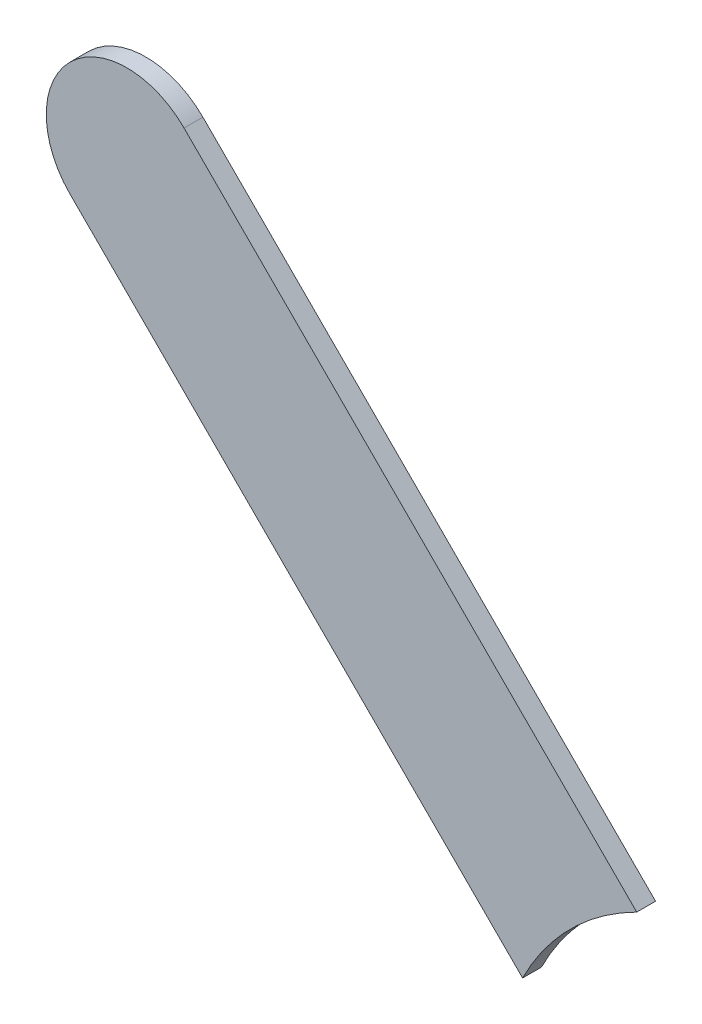
ISO-10303-21;
HEADER;
FILE_DESCRIPTION(('STEP AP214'),'2;1');
FILE_NAME('part.step','',(''),(''),'','','');
FILE_SCHEMA(('AUTOMOTIVE_DESIGN { 1 0 10303 214 1 1 1 1 }'));
ENDSEC;
DATA;
#1=APPLICATION_CONTEXT('core data for automotive mechanical design processes');
#2=APPLICATION_PROTOCOL_DEFINITION('international standard','automotive_design',2000,#1);
#3=PRODUCT_CONTEXT('',#1,'mechanical');
#4=PRODUCT('Part','Part','',(#3));
#5=PRODUCT_RELATED_PRODUCT_CATEGORY('part','',(#4));
#6=PRODUCT_DEFINITION_FORMATION('','',#4);
#7=PRODUCT_DEFINITION_CONTEXT('part definition',#1,'design');
#8=PRODUCT_DEFINITION('design','',#6,#7);
#9=PRODUCT_DEFINITION_SHAPE('','',#8);
#10=(LENGTH_UNIT() NAMED_UNIT(*) SI_UNIT(.MILLI.,.METRE.));
#11=(NAMED_UNIT(*) PLANE_ANGLE_UNIT() SI_UNIT($,.RADIAN.));
#12=(NAMED_UNIT(*) SI_UNIT($,.STERADIAN.) SOLID_ANGLE_UNIT());
#13=UNCERTAINTY_MEASURE_WITH_UNIT(LENGTH_MEASURE(1.E-05),#10,'distance_accuracy_value','');
#14=(GEOMETRIC_REPRESENTATION_CONTEXT(3) GLOBAL_UNCERTAINTY_ASSIGNED_CONTEXT((#13)) GLOBAL_UNIT_ASSIGNED_CONTEXT((#10,
#11,#12)) REPRESENTATION_CONTEXT('',''));
#15=CARTESIAN_POINT('',(0.,0.,0.));
#16=DIRECTION('',(0.,0.,1.));
#17=DIRECTION('',(1.,0.,0.));
#18=AXIS2_PLACEMENT_3D('',#15,#16,#17);
#19=CARTESIAN_POINT('',(165.346066,-68.303933,1.6));
#20=DIRECTION('',(-0.707106781186548,-0.707106781186548,0.));
#21=DIRECTION('',(-0.707106781186548,0.707106781186548,0.));
#22=AXIS2_PLACEMENT_3D('',#19,#20,#21);
#23=PLANE('',#22);
#24=DIRECTION('',(0.,0.,1.));
#25=VECTOR('',#24,1.);
#26=CARTESIAN_POINT('',(164.186066,-67.143933,1.6));
#27=LINE('',#26,#25);
#28=CARTESIAN_POINT('',(164.186066,-67.143933,1.6));
#29=VERTEX_POINT('',#28);
#30=CARTESIAN_POINT('',(164.186066,-67.143933,1.635));
#31=VERTEX_POINT('',#30);
#32=EDGE_CURVE('E11',#29,#31,#27,.T.);
#33=ORIENTED_EDGE('',*,*,#32,.T.);
#34=DIRECTION('',(-0.707106781186548,0.707106781186548,0.));
#35=VECTOR('',#34,1.);
#36=CARTESIAN_POINT('',(165.346066,-68.303933,1.635));
#37=LINE('',#36,#35);
#38=CARTESIAN_POINT('',(165.02737794109,-67.98524494109,1.635));
#39=VERTEX_POINT('',#38);
#40=EDGE_CURVE('E20',#39,#31,#37,.T.);
#41=ORIENTED_EDGE('',*,*,#40,.F.);
#42=DIRECTION('',(0.,0.,-1.));
#43=VECTOR('',#42,1.);
#44=CARTESIAN_POINT('',(165.02737794109,-67.98524494109,-0.045));
#45=LINE('',#44,#43);
#46=CARTESIAN_POINT('',(165.02737794109,-67.98524494109,1.6));
#47=VERTEX_POINT('',#46);
#48=EDGE_CURVE('E57',#39,#47,#45,.T.);
#49=ORIENTED_EDGE('',*,*,#48,.T.);
#50=DIRECTION('',(-0.707106781186548,0.707106781186548,0.));
#51=VECTOR('',#50,1.);
#52=CARTESIAN_POINT('',(165.346066,-68.303933,1.6));
#53=LINE('',#52,#51);
#54=EDGE_CURVE('E73',#47,#29,#53,.T.);
#55=ORIENTED_EDGE('',*,*,#54,.T.);
#56=EDGE_LOOP('',(#33,#41,#49,#55));
#57=FACE_BOUND('',#56,.T.);
#58=ADVANCED_FACE('F17',(#57),#23,.F.);
#59=CARTESIAN_POINT('',(164.0799995,-67.2499995,1.6));
#60=DIRECTION('',(0.,0.,-1.));
#61=DIRECTION('',(0.707106781187048,0.707106781186048,0.));
#62=AXIS2_PLACEMENT_3D('',#59,#60,#61);
#63=CYLINDRICAL_SURFACE('',#62,0.150000682813);
#64=CARTESIAN_POINT('',(164.0799995,-67.2499995,1.6));
#65=DIRECTION('',(0.,0.,1.));
#66=DIRECTION('',(0.707106781187048,0.707106781186048,0.));
#67=AXIS2_PLACEMENT_3D('',#64,#65,#66);
#68=CIRCLE('',#67,0.150000682813);
#69=CARTESIAN_POINT('',(163.973933,-67.356066,1.6));
#70=VERTEX_POINT('',#69);
#71=EDGE_CURVE('E66',#29,#70,#68,.T.);
#72=ORIENTED_EDGE('',*,*,#71,.T.);
#73=DIRECTION('',(0.,0.,1.));
#74=VECTOR('',#73,1.);
#75=CARTESIAN_POINT('',(163.973933,-67.356066,1.6));
#76=LINE('',#75,#74);
#77=CARTESIAN_POINT('',(163.973933,-67.356066,1.635));
#78=VERTEX_POINT('',#77);
#79=EDGE_CURVE('E89',#70,#78,#76,.T.);
#80=ORIENTED_EDGE('',*,*,#79,.T.);
#81=CARTESIAN_POINT('',(164.0799995,-67.2499995,1.635));
#82=DIRECTION('',(0.,0.,1.));
#83=DIRECTION('',(0.707106781187048,0.707106781186048,0.));
#84=AXIS2_PLACEMENT_3D('',#81,#82,#83);
#85=CIRCLE('',#84,0.150000682813);
#86=EDGE_CURVE('E68',#31,#78,#85,.T.);
#87=ORIENTED_EDGE('',*,*,#86,.F.);
#88=ORIENTED_EDGE('',*,*,#32,.F.);
#89=EDGE_LOOP('',(#72,#80,#87,#88));
#90=FACE_BOUND('',#89,.T.);
#91=ADVANCED_FACE('F64',(#90),#63,.T.);
#92=CARTESIAN_POINT('',(163.973933,-67.356066,1.635));
#93=DIRECTION('',(0.,0.,1.));
#94=DIRECTION('',(1.,0.,0.));
#95=AXIS2_PLACEMENT_3D('',#92,#93,#94);
#96=PLANE('',#95);
#97=ORIENTED_EDGE('',*,*,#86,.T.);
#98=DIRECTION('',(0.707106781186548,-0.707106781186548,0.));
#99=VECTOR('',#98,1.);
#100=CARTESIAN_POINT('',(163.973933,-67.356066,1.635));
#101=LINE('',#100,#99);
#102=CARTESIAN_POINT('',(164.81524494108,-68.19737794108,1.635));
#103=VERTEX_POINT('',#102);
#104=EDGE_CURVE('E96',#78,#103,#101,.T.);
#105=ORIENTED_EDGE('',*,*,#104,.T.);
#106=CARTESIAN_POINT('',(165.24,-68.41,1.635));
#107=DIRECTION('',(0.,0.,-1.));
#108=DIRECTION('',(0.,-1.,0.));
#109=AXIS2_PLACEMENT_3D('',#106,#107,#108);
#110=CIRCLE('',#109,0.475);
#111=EDGE_CURVE('E78',#103,#39,#110,.T.);
#112=ORIENTED_EDGE('',*,*,#111,.T.);
#113=ORIENTED_EDGE('',*,*,#40,.T.);
#114=EDGE_LOOP('',(#97,#105,#112,#113));
#115=FACE_BOUND('',#114,.T.);
#116=ADVANCED_FACE('F162',(#115),#96,.T.);
#117=CARTESIAN_POINT('',(165.24,-68.41,-0.045));
#118=DIRECTION('',(0.,0.,-1.));
#119=DIRECTION('',(0.,-1.,0.));
#120=AXIS2_PLACEMENT_3D('',#117,#118,#119);
#121=CYLINDRICAL_SURFACE('',#120,0.475);
#122=ORIENTED_EDGE('',*,*,#111,.F.);
#123=DIRECTION('',(0.,0.,-1.));
#124=VECTOR('',#123,1.);
#125=CARTESIAN_POINT('',(164.81524494109,-68.19737794109,-0.045));
#126=LINE('',#125,#124);
#127=CARTESIAN_POINT('',(164.81524494108,-68.19737794108,1.6));
#128=VERTEX_POINT('',#127);
#129=EDGE_CURVE('E92',#103,#128,#126,.T.);
#130=ORIENTED_EDGE('',*,*,#129,.T.);
#131=CARTESIAN_POINT('',(165.24,-68.41,1.6));
#132=DIRECTION('',(0.,0.,-1.));
#133=DIRECTION('',(0.,-1.,0.));
#134=AXIS2_PLACEMENT_3D('',#131,#132,#133);
#135=CIRCLE('',#134,0.475);
#136=EDGE_CURVE('E79',#128,#47,#135,.T.);
#137=ORIENTED_EDGE('',*,*,#136,.T.);
#138=ORIENTED_EDGE('',*,*,#48,.F.);
#139=EDGE_LOOP('',(#122,#130,#137,#138));
#140=FACE_BOUND('',#139,.T.);
#141=ADVANCED_FACE('F154',(#140),#121,.F.);
#142=CARTESIAN_POINT('',(163.973933,-67.356066,1.6));
#143=DIRECTION('',(0.,0.,1.));
#144=DIRECTION('',(1.,0.,0.));
#145=AXIS2_PLACEMENT_3D('',#142,#143,#144);
#146=PLANE('',#145);
#147=ORIENTED_EDGE('',*,*,#54,.F.);
#148=ORIENTED_EDGE('',*,*,#136,.F.);
#149=DIRECTION('',(0.707106781186548,-0.707106781186548,0.));
#150=VECTOR('',#149,1.);
#151=CARTESIAN_POINT('',(163.973933,-67.356066,1.6));
#152=LINE('',#151,#150);
#153=EDGE_CURVE('E75',#70,#128,#152,.T.);
#154=ORIENTED_EDGE('',*,*,#153,.F.);
#155=ORIENTED_EDGE('',*,*,#71,.F.);
#156=EDGE_LOOP('',(#147,#148,#154,#155));
#157=FACE_BOUND('',#156,.T.);
#158=ADVANCED_FACE('F71',(#157),#146,.F.);
#159=CARTESIAN_POINT('',(163.973933,-67.356066,1.6));
#160=DIRECTION('',(0.707106781186548,0.707106781186548,0.));
#161=DIRECTION('',(0.,0.,-1.));
#162=AXIS2_PLACEMENT_3D('',#159,#160,#161);
#163=PLANE('',#162);
#164=ORIENTED_EDGE('',*,*,#129,.F.);
#165=ORIENTED_EDGE('',*,*,#104,.F.);
#166=ORIENTED_EDGE('',*,*,#79,.F.);
#167=ORIENTED_EDGE('',*,*,#153,.T.);
#168=EDGE_LOOP('',(#164,#165,#166,#167));
#169=FACE_BOUND('',#168,.T.);
#170=ADVANCED_FACE('F139',(#169),#163,.F.);
#171=CLOSED_SHELL('',(#58,#91,#116,#141,#158,#170));
#172=MANIFOLD_SOLID_BREP('B1',#171);
#173=ADVANCED_BREP_SHAPE_REPRESENTATION('',(#18,#172),#14);
#174=SHAPE_DEFINITION_REPRESENTATION(#9,#173);
ENDSEC;
END-ISO-10303-21;
